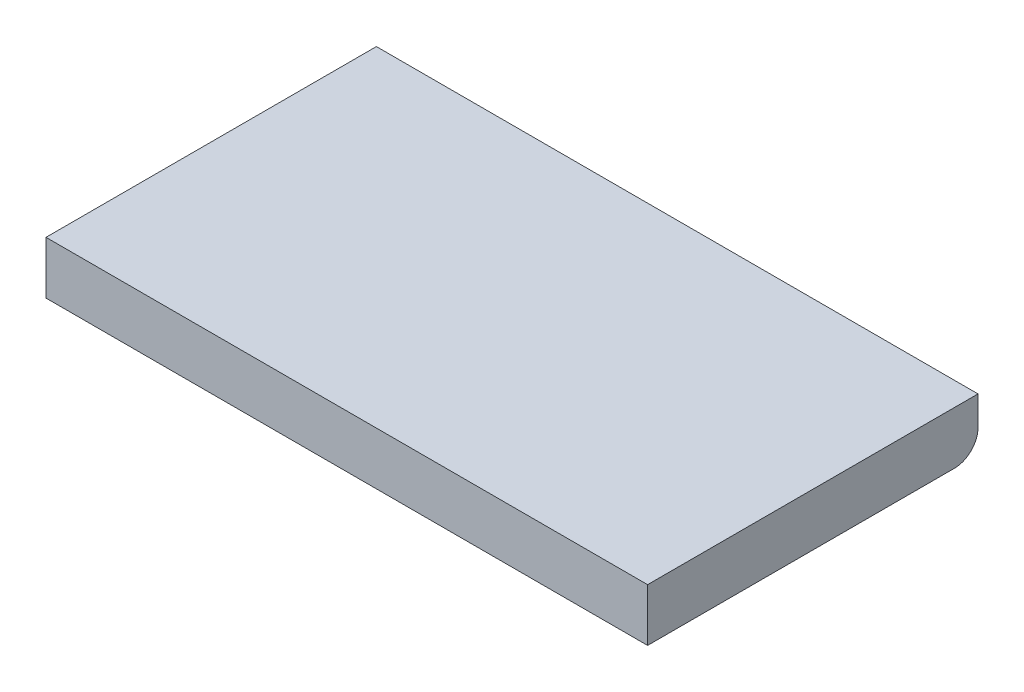
ISO-10303-21;
HEADER;
FILE_DESCRIPTION(('STEP AP214'),'2;1');
FILE_NAME('part.step','',(''),(''),'','','');
FILE_SCHEMA(('AUTOMOTIVE_DESIGN { 1 0 10303 214 1 1 1 1 }'));
ENDSEC;
DATA;
#1=APPLICATION_CONTEXT('core data for automotive mechanical design processes');
#2=APPLICATION_PROTOCOL_DEFINITION('international standard','automotive_design',2000,#1);
#3=PRODUCT_CONTEXT('',#1,'mechanical');
#4=PRODUCT('Part','Part','',(#3));
#5=PRODUCT_RELATED_PRODUCT_CATEGORY('part','',(#4));
#6=PRODUCT_DEFINITION_FORMATION('','',#4);
#7=PRODUCT_DEFINITION_CONTEXT('part definition',#1,'design');
#8=PRODUCT_DEFINITION('design','',#6,#7);
#9=PRODUCT_DEFINITION_SHAPE('','',#8);
#10=(LENGTH_UNIT() NAMED_UNIT(*) SI_UNIT(.MILLI.,.METRE.));
#11=(NAMED_UNIT(*) PLANE_ANGLE_UNIT() SI_UNIT($,.RADIAN.));
#12=(NAMED_UNIT(*) SI_UNIT($,.STERADIAN.) SOLID_ANGLE_UNIT());
#13=UNCERTAINTY_MEASURE_WITH_UNIT(LENGTH_MEASURE(1.E-05),#10,'distance_accuracy_value','');
#14=(GEOMETRIC_REPRESENTATION_CONTEXT(3) GLOBAL_UNCERTAINTY_ASSIGNED_CONTEXT((#13)) GLOBAL_UNIT_ASSIGNED_CONTEXT((#10,
#11,#12)) REPRESENTATION_CONTEXT('',''));
#15=CARTESIAN_POINT('',(0.,0.,0.));
#16=DIRECTION('',(0.,0.,1.));
#17=DIRECTION('',(1.,0.,0.));
#18=AXIS2_PLACEMENT_3D('',#15,#16,#17);
#19=CARTESIAN_POINT('',(326.517,57.15,179.324));
#20=DIRECTION('',(-1.,0.,0.));
#21=DIRECTION('',(0.,0.,1.));
#22=AXIS2_PLACEMENT_3D('',#19,#20,#21);
#23=PLANE('',#22);
#24=DIRECTION('',(0.,0.,-1.));
#25=VECTOR('',#24,1.);
#26=CARTESIAN_POINT('',(326.517,0.,179.324));
#27=LINE('',#26,#25);
#28=CARTESIAN_POINT('',(326.517,0.,179.324));
#29=VERTEX_POINT('',#28);
#30=CARTESIAN_POINT('',(326.517,0.,-153.924));
#31=VERTEX_POINT('',#30);
#32=EDGE_CURVE('E163',#29,#31,#27,.T.);
#33=ORIENTED_EDGE('',*,*,#32,.T.);
#34=CARTESIAN_POINT('',(326.517,25.4,-153.924));
#35=DIRECTION('',(-1.,0.,0.));
#36=DIRECTION('',(0.,0.,1.));
#37=AXIS2_PLACEMENT_3D('',#34,#35,#36);
#38=CIRCLE('',#37,25.4);
#39=CARTESIAN_POINT('',(326.517,25.4,-179.324));
#40=VERTEX_POINT('',#39);
#41=EDGE_CURVE('E11',#31,#40,#38,.F.);
#42=ORIENTED_EDGE('',*,*,#41,.T.);
#43=DIRECTION('',(0.,-1.,0.));
#44=VECTOR('',#43,1.);
#45=CARTESIAN_POINT('',(326.517,57.15,-179.324));
#46=LINE('',#45,#44);
#47=CARTESIAN_POINT('',(326.517,57.15,-179.324));
#48=VERTEX_POINT('',#47);
#49=EDGE_CURVE('E197',#48,#40,#46,.T.);
#50=ORIENTED_EDGE('',*,*,#49,.F.);
#51=DIRECTION('',(0.,0.,-1.));
#52=VECTOR('',#51,1.);
#53=CARTESIAN_POINT('',(326.517,57.15,179.324));
#54=LINE('',#53,#52);
#55=CARTESIAN_POINT('',(326.517,57.15,179.324));
#56=VERTEX_POINT('',#55);
#57=EDGE_CURVE('E165',#56,#48,#54,.T.);
#58=ORIENTED_EDGE('',*,*,#57,.F.);
#59=DIRECTION('',(0.,-1.,0.));
#60=VECTOR('',#59,1.);
#61=CARTESIAN_POINT('',(326.517,57.15,179.324));
#62=LINE('',#61,#60);
#63=EDGE_CURVE('E179',#56,#29,#62,.T.);
#64=ORIENTED_EDGE('',*,*,#63,.T.);
#65=EDGE_LOOP('',(#33,#42,#50,#58,#64));
#66=FACE_BOUND('',#65,.T.);
#67=ADVANCED_FACE('F44',(#66),#23,.F.);
#68=CARTESIAN_POINT('',(-326.517,57.15,-179.324));
#69=DIRECTION('',(0.,0.,1.));
#70=DIRECTION('',(1.,0.,0.));
#71=AXIS2_PLACEMENT_3D('',#68,#69,#70);
#72=PLANE('',#71);
#73=DIRECTION('',(0.,1.,0.));
#74=VECTOR('',#73,1.);
#75=CARTESIAN_POINT('',(-263.017,31.7500000000001,-179.324));
#76=LINE('',#75,#74);
#77=CARTESIAN_POINT('',(-263.017,25.4,-179.324));
#78=VERTEX_POINT('',#77);
#79=CARTESIAN_POINT('',(-263.017,31.7500000000001,-179.324));
#80=VERTEX_POINT('',#79);
#81=EDGE_CURVE('E124',#78,#80,#76,.T.);
#82=ORIENTED_EDGE('',*,*,#81,.F.);
#83=DIRECTION('',(-1.,0.,0.));
#84=VECTOR('',#83,1.);
#85=CARTESIAN_POINT('',(-326.517,25.4,-179.324));
#86=LINE('',#85,#84);
#87=CARTESIAN_POINT('',(-326.517,25.4,-179.324));
#88=VERTEX_POINT('',#87);
#89=EDGE_CURVE('E209',#78,#88,#86,.T.);
#90=ORIENTED_EDGE('',*,*,#89,.T.);
#91=DIRECTION('',(0.,-1.,0.));
#92=VECTOR('',#91,1.);
#93=CARTESIAN_POINT('',(-326.517,57.15,-179.324));
#94=LINE('',#93,#92);
#95=CARTESIAN_POINT('',(-326.517,57.15,-179.324));
#96=VERTEX_POINT('',#95);
#97=EDGE_CURVE('E194',#96,#88,#94,.T.);
#98=ORIENTED_EDGE('',*,*,#97,.F.);
#99=DIRECTION('',(-1.,0.,0.));
#100=VECTOR('',#99,1.);
#101=CARTESIAN_POINT('',(-326.517,57.15,-179.324));
#102=LINE('',#101,#100);
#103=EDGE_CURVE('E169',#48,#96,#102,.T.);
#104=ORIENTED_EDGE('',*,*,#103,.F.);
#105=ORIENTED_EDGE('',*,*,#49,.T.);
#106=DIRECTION('',(-1.,0.,0.));
#107=VECTOR('',#106,1.);
#108=CARTESIAN_POINT('',(263.017,25.4,-179.324));
#109=LINE('',#108,#107);
#110=CARTESIAN_POINT('',(263.017,25.4,-179.324));
#111=VERTEX_POINT('',#110);
#112=EDGE_CURVE('E205',#40,#111,#109,.T.);
#113=ORIENTED_EDGE('',*,*,#112,.T.);
#114=DIRECTION('',(0.,-1.,0.));
#115=VECTOR('',#114,1.);
#116=CARTESIAN_POINT('',(263.017,0.,-179.324));
#117=LINE('',#116,#115);
#118=CARTESIAN_POINT('',(263.017,31.75,-179.324));
#119=VERTEX_POINT('',#118);
#120=EDGE_CURVE('E144',#119,#111,#117,.T.);
#121=ORIENTED_EDGE('',*,*,#120,.F.);
#122=DIRECTION('',(1.,0.,0.));
#123=VECTOR('',#122,1.);
#124=CARTESIAN_POINT('',(263.017,31.75,-179.324));
#125=LINE('',#124,#123);
#126=EDGE_CURVE('E148',#80,#119,#125,.T.);
#127=ORIENTED_EDGE('',*,*,#126,.F.);
#128=EDGE_LOOP('',(#82,#90,#98,#104,#105,#113,#121,#127));
#129=FACE_BOUND('',#128,.T.);
#130=ADVANCED_FACE('F235',(#129),#72,.F.);
#131=CARTESIAN_POINT('',(-326.517,57.15,179.324));
#132=DIRECTION('',(1.,0.,0.));
#133=DIRECTION('',(0.,0.,-1.));
#134=AXIS2_PLACEMENT_3D('',#131,#132,#133);
#135=PLANE('',#134);
#136=ORIENTED_EDGE('',*,*,#97,.T.);
#137=CARTESIAN_POINT('',(-326.517,25.4,-153.924));
#138=DIRECTION('',(1.,0.,0.));
#139=DIRECTION('',(0.,0.,-1.));
#140=AXIS2_PLACEMENT_3D('',#137,#138,#139);
#141=CIRCLE('',#140,25.4);
#142=CARTESIAN_POINT('',(-326.517,0.,-153.924));
#143=VERTEX_POINT('',#142);
#144=EDGE_CURVE('E68',#88,#143,#141,.F.);
#145=ORIENTED_EDGE('',*,*,#144,.T.);
#146=DIRECTION('',(0.,0.,1.));
#147=VECTOR('',#146,1.);
#148=CARTESIAN_POINT('',(-326.517,0.,179.324));
#149=LINE('',#148,#147);
#150=CARTESIAN_POINT('',(-326.517,0.,179.324));
#151=VERTEX_POINT('',#150);
#152=EDGE_CURVE('E182',#143,#151,#149,.T.);
#153=ORIENTED_EDGE('',*,*,#152,.T.);
#154=DIRECTION('',(0.,-1.,0.));
#155=VECTOR('',#154,1.);
#156=CARTESIAN_POINT('',(-326.517,57.15,179.324));
#157=LINE('',#156,#155);
#158=CARTESIAN_POINT('',(-326.517,57.15,179.324));
#159=VERTEX_POINT('',#158);
#160=EDGE_CURVE('E190',#159,#151,#157,.T.);
#161=ORIENTED_EDGE('',*,*,#160,.F.);
#162=DIRECTION('',(0.,0.,1.));
#163=VECTOR('',#162,1.);
#164=CARTESIAN_POINT('',(-326.517,57.15,179.324));
#165=LINE('',#164,#163);
#166=EDGE_CURVE('E173',#96,#159,#165,.T.);
#167=ORIENTED_EDGE('',*,*,#166,.F.);
#168=EDGE_LOOP('',(#136,#145,#153,#161,#167));
#169=FACE_BOUND('',#168,.T.);
#170=ADVANCED_FACE('F246',(#169),#135,.F.);
#171=CARTESIAN_POINT('',(-326.517,57.15,179.324));
#172=DIRECTION('',(0.,0.,-1.));
#173=DIRECTION('',(-1.,0.,0.));
#174=AXIS2_PLACEMENT_3D('',#171,#172,#173);
#175=PLANE('',#174);
#176=DIRECTION('',(1.,0.,0.));
#177=VECTOR('',#176,1.);
#178=CARTESIAN_POINT('',(-326.517,0.,179.324));
#179=LINE('',#178,#177);
#180=EDGE_CURVE('E170',#151,#29,#179,.T.);
#181=ORIENTED_EDGE('',*,*,#180,.T.);
#182=ORIENTED_EDGE('',*,*,#63,.F.);
#183=DIRECTION('',(1.,0.,0.));
#184=VECTOR('',#183,1.);
#185=CARTESIAN_POINT('',(-326.517,57.15,179.324));
#186=LINE('',#185,#184);
#187=EDGE_CURVE('E176',#159,#56,#186,.T.);
#188=ORIENTED_EDGE('',*,*,#187,.F.);
#189=ORIENTED_EDGE('',*,*,#160,.T.);
#190=EDGE_LOOP('',(#181,#182,#188,#189));
#191=FACE_BOUND('',#190,.T.);
#192=ADVANCED_FACE('F244',(#191),#175,.F.);
#193=CARTESIAN_POINT('',(0.,57.15,0.));
#194=DIRECTION('',(0.,-1.,0.));
#195=DIRECTION('',(0.,0.,-1.));
#196=AXIS2_PLACEMENT_3D('',#193,#194,#195);
#197=PLANE('',#196);
#198=ORIENTED_EDGE('',*,*,#57,.T.);
#199=ORIENTED_EDGE('',*,*,#103,.T.);
#200=ORIENTED_EDGE('',*,*,#166,.T.);
#201=ORIENTED_EDGE('',*,*,#187,.T.);
#202=EDGE_LOOP('',(#198,#199,#200,#201));
#203=FACE_BOUND('',#202,.T.);
#204=ADVANCED_FACE('F239',(#203),#197,.F.);
#205=CARTESIAN_POINT('',(0.,0.,0.));
#206=DIRECTION('',(0.,-1.,0.));
#207=DIRECTION('',(0.,0.,-1.));
#208=AXIS2_PLACEMENT_3D('',#205,#206,#207);
#209=PLANE('',#208);
#210=ORIENTED_EDGE('',*,*,#152,.F.);
#211=DIRECTION('',(-1.,0.,0.));
#212=VECTOR('',#211,1.);
#213=CARTESIAN_POINT('',(-263.017,0.,-153.924));
#214=LINE('',#213,#212);
#215=CARTESIAN_POINT('',(-263.017,0.,-153.924));
#216=VERTEX_POINT('',#215);
#217=EDGE_CURVE('E217',#143,#216,#214,.F.);
#218=ORIENTED_EDGE('',*,*,#217,.T.);
#219=DIRECTION('',(-1.,0.,0.));
#220=VECTOR('',#219,1.);
#221=CARTESIAN_POINT('',(263.017,0.,-153.924));
#222=LINE('',#221,#220);
#223=CARTESIAN_POINT('',(263.017,0.,-153.924));
#224=VERTEX_POINT('',#223);
#225=EDGE_CURVE('E130',#224,#216,#222,.T.);
#226=ORIENTED_EDGE('',*,*,#225,.F.);
#227=DIRECTION('',(-1.,0.,0.));
#228=VECTOR('',#227,1.);
#229=CARTESIAN_POINT('',(326.517,0.,-153.924));
#230=LINE('',#229,#228);
#231=EDGE_CURVE('E60',#224,#31,#230,.F.);
#232=ORIENTED_EDGE('',*,*,#231,.T.);
#233=ORIENTED_EDGE('',*,*,#32,.F.);
#234=ORIENTED_EDGE('',*,*,#180,.F.);
#235=EDGE_LOOP('',(#210,#218,#226,#232,#233,#234));
#236=FACE_BOUND('',#235,.T.);
#237=ADVANCED_FACE('F228',(#236),#209,.T.);
#238=CARTESIAN_POINT('',(-263.017,31.7500000000001,-153.924));
#239=DIRECTION('',(-1.,0.,0.));
#240=DIRECTION('',(0.,0.,1.));
#241=AXIS2_PLACEMENT_3D('',#238,#239,#240);
#242=PLANE('',#241);
#243=CARTESIAN_POINT('',(-263.017,17.1437860424799,-165.585268519493));
#244=DIRECTION('',(-1.,0.,0.));
#245=DIRECTION('',(0.,0.,1.));
#246=AXIS2_PLACEMENT_3D('',#243,#244,#245);
#247=CIRCLE('',#246,9.525);
#248=CARTESIAN_POINT('',(-263.017,17.1437860424799,-156.060268519493));
#249=VERTEX_POINT('',#248);
#250=EDGE_CURVE('E389',#249,#249,#247,.T.);
#251=ORIENTED_EDGE('',*,*,#250,.T.);
#252=EDGE_LOOP('',(#251));
#253=FACE_BOUND('',#252,.T.);
#254=DIRECTION('',(0.,1.,0.));
#255=VECTOR('',#254,1.);
#256=CARTESIAN_POINT('',(-263.017,31.7500000000001,-153.924));
#257=LINE('',#256,#255);
#258=CARTESIAN_POINT('',(-263.017,31.7500000000001,-153.924));
#259=VERTEX_POINT('',#258);
#260=EDGE_CURVE('E121',#216,#259,#257,.T.);
#261=ORIENTED_EDGE('',*,*,#260,.F.);
#262=CARTESIAN_POINT('',(-263.017,25.4,-153.924));
#263=DIRECTION('',(-1.,0.,0.));
#264=DIRECTION('',(0.,0.,1.));
#265=AXIS2_PLACEMENT_3D('',#262,#263,#264);
#266=CIRCLE('',#265,25.4);
#267=EDGE_CURVE('E220',#216,#78,#266,.F.);
#268=ORIENTED_EDGE('',*,*,#267,.T.);
#269=ORIENTED_EDGE('',*,*,#81,.T.);
#270=DIRECTION('',(0.,0.,-1.));
#271=VECTOR('',#270,1.);
#272=CARTESIAN_POINT('',(-263.017,31.7500000000001,-153.924));
#273=LINE('',#272,#271);
#274=EDGE_CURVE('E117',#259,#80,#273,.T.);
#275=ORIENTED_EDGE('',*,*,#274,.F.);
#276=EDGE_LOOP('',(#261,#268,#269,#275));
#277=FACE_BOUND('',#276,.T.);
#278=ADVANCED_FACE('F119',(#253,#277),#242,.F.);
#279=CARTESIAN_POINT('',(263.017,0.,-153.924));
#280=DIRECTION('',(1.,0.,0.));
#281=DIRECTION('',(0.,0.,-1.));
#282=AXIS2_PLACEMENT_3D('',#279,#280,#281);
#283=PLANE('',#282);
#284=CARTESIAN_POINT('',(263.017,17.1437860424799,-165.585268519493));
#285=DIRECTION('',(1.,0.,0.));
#286=DIRECTION('',(0.,0.,-1.));
#287=AXIS2_PLACEMENT_3D('',#284,#285,#286);
#288=CIRCLE('',#287,9.525);
#289=CARTESIAN_POINT('',(263.017,17.1437860424799,-175.110268519493));
#290=VERTEX_POINT('',#289);
#291=EDGE_CURVE('E201',#290,#290,#288,.F.);
#292=ORIENTED_EDGE('',*,*,#291,.F.);
#293=EDGE_LOOP('',(#292));
#294=FACE_BOUND('',#293,.T.);
#295=ORIENTED_EDGE('',*,*,#120,.T.);
#296=CARTESIAN_POINT('',(263.017,25.4,-153.924));
#297=DIRECTION('',(1.,0.,0.));
#298=DIRECTION('',(0.,0.,-1.));
#299=AXIS2_PLACEMENT_3D('',#296,#297,#298);
#300=CIRCLE('',#299,25.4);
#301=EDGE_CURVE('E53',#111,#224,#300,.F.);
#302=ORIENTED_EDGE('',*,*,#301,.T.);
#303=DIRECTION('',(0.,-1.,0.));
#304=VECTOR('',#303,1.);
#305=CARTESIAN_POINT('',(263.017,0.,-153.924));
#306=LINE('',#305,#304);
#307=CARTESIAN_POINT('',(263.017,31.75,-153.924));
#308=VERTEX_POINT('',#307);
#309=EDGE_CURVE('E139',#308,#224,#306,.T.);
#310=ORIENTED_EDGE('',*,*,#309,.F.);
#311=DIRECTION('',(0.,0.,-1.));
#312=VECTOR('',#311,1.);
#313=CARTESIAN_POINT('',(263.017,31.75,-153.924));
#314=LINE('',#313,#312);
#315=EDGE_CURVE('E129',#308,#119,#314,.T.);
#316=ORIENTED_EDGE('',*,*,#315,.T.);
#317=EDGE_LOOP('',(#295,#302,#310,#316));
#318=FACE_BOUND('',#317,.T.);
#319=ADVANCED_FACE('F224',(#294,#318),#283,.F.);
#320=CARTESIAN_POINT('',(263.017,31.75,-153.924));
#321=DIRECTION('',(0.,1.,0.));
#322=DIRECTION('',(-1.,0.,0.));
#323=AXIS2_PLACEMENT_3D('',#320,#321,#322);
#324=PLANE('',#323);
#325=ORIENTED_EDGE('',*,*,#126,.T.);
#326=ORIENTED_EDGE('',*,*,#315,.F.);
#327=DIRECTION('',(1.,0.,0.));
#328=VECTOR('',#327,1.);
#329=CARTESIAN_POINT('',(263.017,31.75,-153.924));
#330=LINE('',#329,#328);
#331=EDGE_CURVE('E133',#259,#308,#330,.T.);
#332=ORIENTED_EDGE('',*,*,#331,.F.);
#333=ORIENTED_EDGE('',*,*,#274,.T.);
#334=EDGE_LOOP('',(#325,#326,#332,#333));
#335=FACE_BOUND('',#334,.T.);
#336=ADVANCED_FACE('F134',(#335),#324,.F.);
#337=CARTESIAN_POINT('',(0.,0.,-153.924));
#338=DIRECTION('',(0.,0.,-1.));
#339=DIRECTION('',(-1.,0.,0.));
#340=AXIS2_PLACEMENT_3D('',#337,#338,#339);
#341=PLANE('',#340);
#342=ORIENTED_EDGE('',*,*,#260,.T.);
#343=ORIENTED_EDGE('',*,*,#331,.T.);
#344=ORIENTED_EDGE('',*,*,#309,.T.);
#345=ORIENTED_EDGE('',*,*,#225,.T.);
#346=EDGE_LOOP('',(#342,#343,#344,#345));
#347=FACE_BOUND('',#346,.T.);
#348=ADVANCED_FACE('F141',(#347),#341,.T.);
#349=CARTESIAN_POINT('',(237.617,17.1437860424799,-165.585268519493));
#350=DIRECTION('',(1.,0.,0.));
#351=DIRECTION('',(0.,0.,-1.));
#352=AXIS2_PLACEMENT_3D('',#349,#350,#351);
#353=CYLINDRICAL_SURFACE('',#352,9.525);
#354=CARTESIAN_POINT('',(237.617,17.1437860424799,-165.585268519493));
#355=DIRECTION('',(-1.,0.,0.));
#356=DIRECTION('',(0.,0.,1.));
#357=AXIS2_PLACEMENT_3D('',#354,#355,#356);
#358=CIRCLE('',#357,9.525);
#359=CARTESIAN_POINT('',(237.617,17.1437860424799,-156.060268519493));
#360=VERTEX_POINT('',#359);
#361=EDGE_CURVE('E151',#360,#360,#358,.T.);
#362=ORIENTED_EDGE('',*,*,#361,.F.);
#363=EDGE_LOOP('',(#362));
#364=FACE_BOUND('',#363,.T.);
#365=ORIENTED_EDGE('',*,*,#291,.T.);
#366=EDGE_LOOP('',(#365));
#367=FACE_BOUND('',#366,.T.);
#368=ADVANCED_FACE('F283',(#364,#367),#353,.T.);
#369=CARTESIAN_POINT('',(237.617,17.1437860424799,-165.585268519493));
#370=DIRECTION('',(-1.,0.,0.));
#371=DIRECTION('',(0.,0.,1.));
#372=AXIS2_PLACEMENT_3D('',#369,#370,#371);
#373=PLANE('',#372);
#374=ORIENTED_EDGE('',*,*,#361,.T.);
#375=EDGE_LOOP('',(#374));
#376=FACE_BOUND('',#375,.T.);
#377=ADVANCED_FACE('F276',(#376),#373,.T.);
#378=CARTESIAN_POINT('',(-237.617,17.1437860424799,-165.585268519493));
#379=DIRECTION('',(-1.,0.,0.));
#380=DIRECTION('',(0.,0.,1.));
#381=AXIS2_PLACEMENT_3D('',#378,#379,#380);
#382=CYLINDRICAL_SURFACE('',#381,9.525);
#383=CARTESIAN_POINT('',(-237.617,17.1437860424799,-165.585268519493));
#384=DIRECTION('',(-1.,0.,0.));
#385=DIRECTION('',(0.,0.,1.));
#386=AXIS2_PLACEMENT_3D('',#383,#384,#385);
#387=CIRCLE('',#386,9.525);
#388=CARTESIAN_POINT('',(-237.617,17.1437860424799,-156.060268519493));
#389=VERTEX_POINT('',#388);
#390=EDGE_CURVE('E392',#389,#389,#387,.T.);
#391=ORIENTED_EDGE('',*,*,#390,.T.);
#392=EDGE_LOOP('',(#391));
#393=FACE_BOUND('',#392,.T.);
#394=ORIENTED_EDGE('',*,*,#250,.F.);
#395=EDGE_LOOP('',(#394));
#396=FACE_BOUND('',#395,.T.);
#397=ADVANCED_FACE('F269',(#393,#396),#382,.T.);
#398=CARTESIAN_POINT('',(-237.617,17.1437860424799,-165.585268519493));
#399=DIRECTION('',(1.,0.,0.));
#400=DIRECTION('',(0.,0.,1.));
#401=AXIS2_PLACEMENT_3D('',#398,#399,#400);
#402=PLANE('',#401);
#403=ORIENTED_EDGE('',*,*,#390,.F.);
#404=EDGE_LOOP('',(#403));
#405=FACE_BOUND('',#404,.T.);
#406=ADVANCED_FACE('F263',(#405),#402,.T.);
#407=CARTESIAN_POINT('',(-326.517,25.4,-153.924));
#408=DIRECTION('',(1.,0.,0.));
#409=DIRECTION('',(0.,0.,-1.));
#410=AXIS2_PLACEMENT_3D('',#407,#408,#409);
#411=CYLINDRICAL_SURFACE('',#410,25.4);
#412=ORIENTED_EDGE('',*,*,#267,.F.);
#413=ORIENTED_EDGE('',*,*,#217,.F.);
#414=ORIENTED_EDGE('',*,*,#144,.F.);
#415=ORIENTED_EDGE('',*,*,#89,.F.);
#416=EDGE_LOOP('',(#412,#413,#414,#415));
#417=FACE_BOUND('',#416,.T.);
#418=ADVANCED_FACE('F261',(#417),#411,.T.);
#419=CARTESIAN_POINT('',(-326.517,25.4,-153.924));
#420=DIRECTION('',(1.,0.,0.));
#421=DIRECTION('',(0.,0.,-1.));
#422=AXIS2_PLACEMENT_3D('',#419,#420,#421);
#423=CYLINDRICAL_SURFACE('',#422,25.4);
#424=ORIENTED_EDGE('',*,*,#41,.F.);
#425=ORIENTED_EDGE('',*,*,#231,.F.);
#426=ORIENTED_EDGE('',*,*,#301,.F.);
#427=ORIENTED_EDGE('',*,*,#112,.F.);
#428=EDGE_LOOP('',(#424,#425,#426,#427));
#429=FACE_BOUND('',#428,.T.);
#430=ADVANCED_FACE('F46',(#429),#423,.T.);
#431=CLOSED_SHELL('',(#67,#130,#170,#192,#204,#237,#278,#319,#336,#348,#368,#377,#397,#406,#418,#430));
#432=MANIFOLD_SOLID_BREP('B2',#431);
#433=ADVANCED_BREP_SHAPE_REPRESENTATION('',(#18,#432),#14);
#434=SHAPE_DEFINITION_REPRESENTATION(#9,#433);
ENDSEC;
END-ISO-10303-21;
